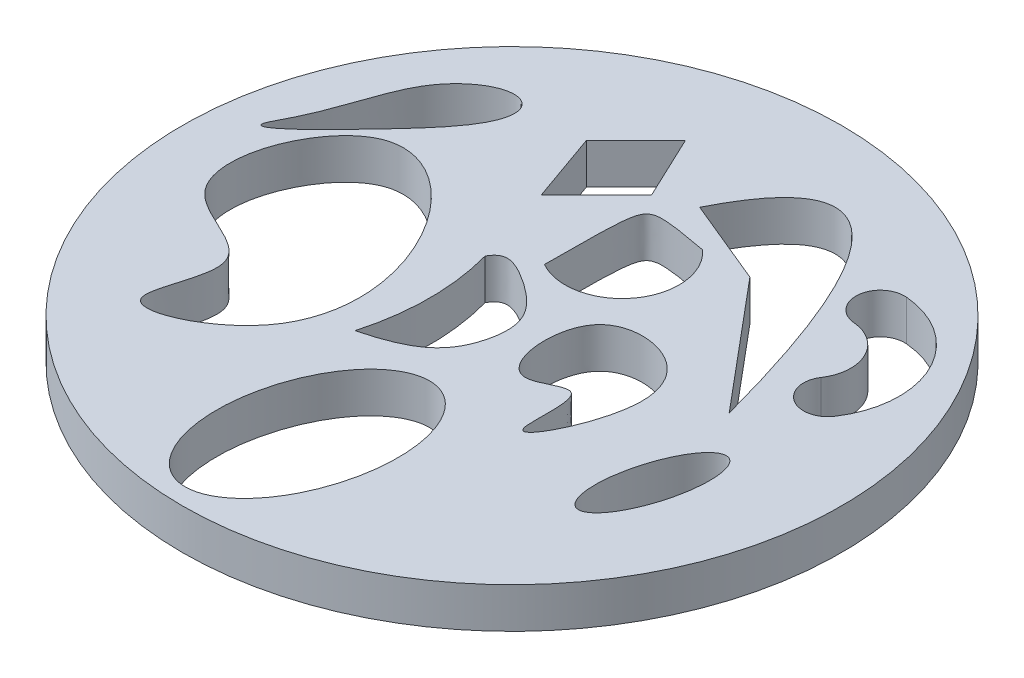
ISO-10303-21;
HEADER;
FILE_DESCRIPTION(('STEP AP214'),'2;1');
FILE_NAME('part.step','',(''),(''),'','','');
FILE_SCHEMA(('AUTOMOTIVE_DESIGN { 1 0 10303 214 1 1 1 1 }'));
ENDSEC;
DATA;
#1=APPLICATION_CONTEXT('core data for automotive mechanical design processes');
#2=APPLICATION_PROTOCOL_DEFINITION('international standard','automotive_design',2000,#1);
#3=PRODUCT_CONTEXT('',#1,'mechanical');
#4=PRODUCT('Part','Part','',(#3));
#5=PRODUCT_RELATED_PRODUCT_CATEGORY('part','',(#4));
#6=PRODUCT_DEFINITION_FORMATION('','',#4);
#7=PRODUCT_DEFINITION_CONTEXT('part definition',#1,'design');
#8=PRODUCT_DEFINITION('design','',#6,#7);
#9=PRODUCT_DEFINITION_SHAPE('','',#8);
#10=(LENGTH_UNIT() NAMED_UNIT(*) SI_UNIT(.MILLI.,.METRE.));
#11=(NAMED_UNIT(*) PLANE_ANGLE_UNIT() SI_UNIT($,.RADIAN.));
#12=(NAMED_UNIT(*) SI_UNIT($,.STERADIAN.) SOLID_ANGLE_UNIT());
#13=UNCERTAINTY_MEASURE_WITH_UNIT(LENGTH_MEASURE(1.E-05),#10,'distance_accuracy_value','');
#14=(GEOMETRIC_REPRESENTATION_CONTEXT(3) GLOBAL_UNCERTAINTY_ASSIGNED_CONTEXT((#13)) GLOBAL_UNIT_ASSIGNED_CONTEXT((#10,
#11,#12)) REPRESENTATION_CONTEXT('',''));
#15=CARTESIAN_POINT('',(0.,0.,0.));
#16=DIRECTION('',(0.,0.,1.));
#17=DIRECTION('',(1.,0.,0.));
#18=AXIS2_PLACEMENT_3D('',#15,#16,#17);
#19=CARTESIAN_POINT('',(0.,10.,0.));
#20=DIRECTION('',(0.,1.,0.));
#21=DIRECTION('',(0.,0.,1.));
#22=AXIS2_PLACEMENT_3D('',#19,#20,#21);
#23=PLANE('',#22);
#24=DIRECTION('',(0.642401427443981,0.,0.766368322686902));
#25=VECTOR('',#24,1.);
#26=CARTESIAN_POINT('',(47.7077937682597,10.,-5.98928534239551));
#27=LINE('',#26,#25);
#28=CARTESIAN_POINT('',(21.1652335710862,10.,-37.6538745993953));
#29=VERTEX_POINT('',#28);
#30=CARTESIAN_POINT('',(47.7077937682604,10.,-5.98928534239551));
#31=VERTEX_POINT('',#30);
#32=EDGE_CURVE('E201',#29,#31,#27,.T.);
#33=ORIENTED_EDGE('',*,*,#32,.F.);
#34=DIRECTION('',(0.92405875541636,0.,0.38225046309765));
#35=VECTOR('',#34,1.);
#36=CARTESIAN_POINT('',(21.1652335710862,10.,-37.6538745993953));
#37=LINE('',#36,#35);
#38=CARTESIAN_POINT('',(-1.30695454458873E-08,10.,-46.4091840021159));
#39=VERTEX_POINT('',#38);
#40=EDGE_CURVE('E194',#39,#29,#37,.T.);
#41=ORIENTED_EDGE('',*,*,#40,.F.);
#42=CARTESIAN_POINT('',(4110.14192783815,10.,999936.835006061));
#43=CARTESIAN_POINT('',(16.7558099104435,10.,-1000063.16499394));
#44=CARTESIAN_POINT('',(-4076.63030801726,10.,999936.835006061));
#45=B_SPLINE_CURVE_WITH_KNOTS('',2,(#42,#43,#44),.UNSPECIFIED.,.F.,.F.,(3,3),(0.,1.),.UNSPECIFIED.);
#46=EDGE_CURVE('E211',#31,#39,#45,.T.);
#47=ORIENTED_EDGE('',*,*,#46,.F.);
#48=EDGE_LOOP('',(#33,#41,#47));
#49=FACE_BOUND('',#48,.T.);
#50=CARTESIAN_POINT('',(-60.2461256371498,10.,-38.0722253658242));
#51=CARTESIAN_POINT('',(-68.8475962548978,10.,-23.7834864466906));
#52=CARTESIAN_POINT('',(-66.4014913895066,10.,-2.84437785859137));
#53=CARTESIAN_POINT('',(-76.8125951960883,10.,-17.3340389644636));
#54=CARTESIAN_POINT('',(-76.8125951960883,10.,-4.5885593225421));
#55=CARTESIAN_POINT('',(-72.4962680677095,10.,1.15153525530332));
#56=CARTESIAN_POINT('',(-66.9644620234067,10.,-13.2488511846418));
#57=CARTESIAN_POINT('',(-56.5475600024001,10.,-25.8149536521159));
#58=CARTESIAN_POINT('',(-50.1294162151567,10.,-35.5592282174939));
#59=CARTESIAN_POINT('',(-34.3655391627635,10.,-29.0283284743964));
#60=CARTESIAN_POINT('',(-31.9956089185147,10.,-59.9993335351259));
#61=CARTESIAN_POINT('',(-51.6446550194019,10.,-52.3609642849578));
#62=CARTESIAN_POINT('',(-60.2461256371498,10.,-38.0722253658242));
#63=B_SPLINE_CURVE_WITH_KNOTS('',12,(#50,#51,#52,#53,#54,#55,#56,#57,#58,#59,#60,#61,#62),
.UNSPECIFIED.,.T.,.F.,(13,13),(0.,1.),.UNSPECIFIED.);
#64=CARTESIAN_POINT('',(-60.2461256371498,10.,-38.0722253658242));
#65=VERTEX_POINT('',#64);
#66=EDGE_CURVE('E244',#65,#65,#63,.T.);
#67=ORIENTED_EDGE('',*,*,#66,.F.);
#68=EDGE_LOOP('',(#67));
#69=FACE_BOUND('',#68,.T.);
#70=CARTESIAN_POINT('',(53.1183360046607,10.,18.4093437831844));
#71=DIRECTION('',(0.,1.,0.));
#72=DIRECTION('',(-0.252123273324646,0.,0.967695125051308));
#73=AXIS2_PLACEMENT_3D('',#70,#71,#72);
#74=ELLIPSE('',#73,15.3556656612494,5.59116409325104);
#75=CARTESIAN_POINT('',(49.2468153140676,10.,33.2689465854933));
#76=VERTEX_POINT('',#75);
#77=EDGE_CURVE('E395',#76,#76,#74,.T.);
#78=ORIENTED_EDGE('',*,*,#77,.F.);
#79=EDGE_LOOP('',(#78));
#80=FACE_BOUND('',#79,.T.);
#81=DIRECTION('',(-0.707106781186541,0.,0.707106781186554));
#82=VECTOR('',#81,1.);
#83=CARTESIAN_POINT('',(-16.0943963613468,10.,-58.9760414610997));
#84=LINE('',#83,#82);
#85=CARTESIAN_POINT('',(-16.0943963613468,10.,-58.9760414610997));
#86=VERTEX_POINT('',#85);
#87=CARTESIAN_POINT('',(-28.3305470196309,10.,-46.7398908028154));
#88=VERTEX_POINT('',#87);
#89=EDGE_CURVE('E406',#86,#88,#84,.T.);
#90=ORIENTED_EDGE('',*,*,#89,.F.);
#91=DIRECTION('',(-0.427682246328038,0.,-0.903929143338018));
#92=VECTOR('',#91,1.);
#93=CARTESIAN_POINT('',(-8.57081724037484,10.,-43.0745573849061));
#94=LINE('',#93,#92);
#95=CARTESIAN_POINT('',(-8.57081724037484,10.,-43.0745573849061));
#96=VERTEX_POINT('',#95);
#97=EDGE_CURVE('E411',#96,#86,#94,.T.);
#98=ORIENTED_EDGE('',*,*,#97,.F.);
#99=DIRECTION('',(0.707106781186541,0.,-0.707106781186554));
#100=VECTOR('',#99,1.);
#101=CARTESIAN_POINT('',(-22.2124716904889,10.,-29.4329029347918));
#102=LINE('',#101,#100);
#103=CARTESIAN_POINT('',(-22.2124716904889,10.,-29.4329029347918));
#104=VERTEX_POINT('',#103);
#105=EDGE_CURVE('E417',#104,#96,#102,.T.);
#106=ORIENTED_EDGE('',*,*,#105,.F.);
#107=DIRECTION('',(0.333291257175319,0.,0.942823916694149));
#108=VECTOR('',#107,1.);
#109=CARTESIAN_POINT('',(-28.3305470196309,10.,-46.7398908028154));
#110=LINE('',#109,#108);
#111=EDGE_CURVE('E410',#88,#104,#110,.T.);
#112=ORIENTED_EDGE('',*,*,#111,.F.);
#113=EDGE_LOOP('',(#90,#98,#106,#112));
#114=FACE_BOUND('',#113,.T.);
#115=CARTESIAN_POINT('',(0.,10.,0.));
#116=DIRECTION('',(0.,1.,0.));
#117=DIRECTION('',(0.,0.,1.));
#118=AXIS2_PLACEMENT_3D('',#115,#116,#117);
#119=CIRCLE('',#118,81.477824485353);
#120=CARTESIAN_POINT('',(0.,10.,81.477824485353));
#121=VERTEX_POINT('',#120);
#122=EDGE_CURVE('E12',#121,#121,#119,.T.);
#123=ORIENTED_EDGE('',*,*,#122,.T.);
#124=EDGE_LOOP('',(#123));
#125=FACE_BOUND('',#124,.T.);
#126=CARTESIAN_POINT('',(-53.8457405612419,10.,-21.6533198344786));
#127=CARTESIAN_POINT('',(-64.2193672371354,10.,-17.4131257533633));
#128=CARTESIAN_POINT('',(-77.2513463662583,10.,15.4345354592304));
#129=CARTESIAN_POINT('',(-39.38956165981,10.,18.7157987433738));
#130=CARTESIAN_POINT('',(-57.7600365583191,10.,50.5739384334702));
#131=CARTESIAN_POINT('',(-1.86321618465855,10.,26.4172559044941));
#132=CARTESIAN_POINT('',(-36.0843087629834,10.,-28.9132608691913));
#133=CARTESIAN_POINT('',(-53.8457405612419,10.,-21.6533198344786));
#134=B_SPLINE_CURVE_WITH_KNOTS('',3,(#126,#127,#128,#129,#130,#131,#132,#133),.UNSPECIFIED.,.T.,
.F.,(4,1,1,1,1,4),(0.,0.221507195278026,0.35881524918199,0.472151534073453,0.620741610945306,
1.),.UNSPECIFIED.);
#135=CARTESIAN_POINT('',(-53.8457405612419,10.,-21.6533198344786));
#136=VERTEX_POINT('',#135);
#137=EDGE_CURVE('E322',#136,#136,#134,.T.);
#138=ORIENTED_EDGE('',*,*,#137,.F.);
#139=EDGE_LOOP('',(#138));
#140=FACE_BOUND('',#139,.T.);
#141=CARTESIAN_POINT('',(42.9554537836132,10.,-30.6089844020252));
#142=DIRECTION('',(0.,1.,0.));
#143=DIRECTION('',(0.,0.,1.));
#144=AXIS2_PLACEMENT_3D('',#141,#142,#143);
#145=CIRCLE('',#144,22.1933698362384);
#146=CARTESIAN_POINT('',(61.4432220004069,10.,-18.3310329829093));
#147=VERTEX_POINT('',#146);
#148=CARTESIAN_POINT('',(44.8189508500984,10.,-52.7239802955644));
#149=VERTEX_POINT('',#148);
#150=EDGE_CURVE('E350',#147,#149,#145,.T.);
#151=ORIENTED_EDGE('',*,*,#150,.F.);
#152=CARTESIAN_POINT('',(56.44062285623,10.,-21.6533198344786));
#153=DIRECTION('',(0.,1.,0.));
#154=DIRECTION('',(0.,0.,1.));
#155=AXIS2_PLACEMENT_3D('',#152,#153,#154);
#156=CIRCLE('',#155,6.00529667222442);
#157=CARTESIAN_POINT('',(51.4380237120531,10.,-24.975606686048));
#158=VERTEX_POINT('',#157);
#159=EDGE_CURVE('E355',#158,#147,#156,.T.);
#160=ORIENTED_EDGE('',*,*,#159,.F.);
#161=CARTESIAN_POINT('',(42.9554537836132,10.,-30.6089844020252));
#162=DIRECTION('',(0.,-1.,0.));
#163=DIRECTION('',(0.,0.,1.));
#164=AXIS2_PLACEMENT_3D('',#161,#162,#163);
#165=CIRCLE('',#164,10.1827764917895);
#166=CARTESIAN_POINT('',(43.8104647288253,10.,-40.7558013100663));
#167=VERTEX_POINT('',#166);
#168=EDGE_CURVE('E362',#167,#158,#165,.T.);
#169=ORIENTED_EDGE('',*,*,#168,.F.);
#170=CARTESIAN_POINT('',(44.3147077894618,10.,-46.7398908028154));
#171=DIRECTION('',(0.,1.,0.));
#172=DIRECTION('',(0.,0.,1.));
#173=AXIS2_PLACEMENT_3D('',#170,#171,#172);
#174=CIRCLE('',#173,6.00529667222442);
#175=EDGE_CURVE('E354',#149,#167,#174,.T.);
#176=ORIENTED_EDGE('',*,*,#175,.F.);
#177=EDGE_LOOP('',(#151,#160,#169,#176));
#178=FACE_BOUND('',#177,.T.);
#179=CARTESIAN_POINT('',(0.,10.,50.5981365058781));
#180=DIRECTION('',(0.,1.,0.));
#181=DIRECTION('',(0.213452035004488,0.,-0.976953544828229));
#182=AXIS2_PLACEMENT_3D('',#179,#180,#181);
#183=ELLIPSE('',#182,26.8549829413215,15.6384075360934);
#184=CARTESIAN_POINT('',(5.73225075883588,10.,24.3620657250524));
#185=VERTEX_POINT('',#184);
#186=EDGE_CURVE('E370',#185,#185,#183,.T.);
#187=ORIENTED_EDGE('',*,*,#186,.F.);
#188=EDGE_LOOP('',(#187));
#189=FACE_BOUND('',#188,.T.);
#190=CARTESIAN_POINT('',(0.,10.,-27.2281911044703));
#191=DIRECTION('',(0.,1.,0.));
#192=DIRECTION('',(0.,0.,-1.));
#193=AXIS2_PLACEMENT_3D('',#190,#191,#192);
#194=CIRCLE('',#193,14.0914946867553);
#195=CARTESIAN_POINT('',(-6.94728403857215,10.,-14.9682780952253));
#196=VERTEX_POINT('',#195);
#197=CARTESIAN_POINT('',(9.48026087038239,10.,-37.6538745993953));
#198=VERTEX_POINT('',#197);
#199=EDGE_CURVE('E485',#196,#198,#194,.T.);
#200=ORIENTED_EDGE('',*,*,#199,.F.);
#201=CARTESIAN_POINT('',(9.48026087038239,10.,-37.6538745993953));
#202=CARTESIAN_POINT('',(-6.94728403857216,10.,-40.7558013100663));
#203=CARTESIAN_POINT('',(-6.94728403857216,10.,-14.9682780952253));
#204=(BOUNDED_CURVE() B_SPLINE_CURVE(2,(#201,#202,#203),.UNSPECIFIED.,.F.,
.F.) B_SPLINE_CURVE_WITH_KNOTS((3,3),(0.,1.),
.UNSPECIFIED.) CURVE() GEOMETRIC_REPRESENTATION_ITEM() RATIONAL_B_SPLINE_CURVE((1.,
4.38264064922356,1.)) REPRESENTATION_ITEM(''));
#205=EDGE_CURVE('E266',#198,#196,#204,.T.);
#206=ORIENTED_EDGE('',*,*,#205,.F.);
#207=EDGE_LOOP('',(#200,#206));
#208=FACE_BOUND('',#207,.T.);
#209=CARTESIAN_POINT('',(15.2779976778549,10.,11.5747371091878));
#210=CARTESIAN_POINT('',(17.9895501551219,10.,11.3423388961398));
#211=CARTESIAN_POINT('',(27.4077540305126,10.,3.65496847968335));
#212=CARTESIAN_POINT('',(22.1887993003057,10.,35.4569639548572));
#213=CARTESIAN_POINT('',(39.4257297555551,10.,1.96505973056979));
#214=CARTESIAN_POINT('',(27.9498160705828,10.,-13.1048258605977));
#215=CARTESIAN_POINT('',(6.42234260404827,10.,-11.4186738447599));
#216=CARTESIAN_POINT('',(9.05419731412701,10.,12.1081584960222));
#217=CARTESIAN_POINT('',(15.2779976778549,10.,11.5747371091878));
#218=B_SPLINE_CURVE_WITH_KNOTS('',3,(#209,#210,#211,#212,#213,#214,#215,#216,#217),
.UNSPECIFIED.,.T.,.F.,(4,1,1,1,1,1,4),(0.,0.0908807333487496,0.237667111495493,0.46104858220229,
0.642529712534307,0.791402325415475,1.),.UNSPECIFIED.);
#219=CARTESIAN_POINT('',(15.2779976778549,10.,11.5747371091878));
#220=VERTEX_POINT('',#219);
#221=EDGE_CURVE('E189',#220,#220,#218,.T.);
#222=ORIENTED_EDGE('',*,*,#221,.F.);
#223=EDGE_LOOP('',(#222));
#224=FACE_BOUND('',#223,.T.);
#225=CARTESIAN_POINT('',(-73.2719421690832,10.,6.40055403903952));
#226=DIRECTION('',(0.,-1.,0.));
#227=DIRECTION('',(0.,0.,-1.));
#228=AXIS2_PLACEMENT_3D('',#225,#226,#227);
#229=CIRCLE('',#228,59.3304162015585);
#230=CARTESIAN_POINT('',(-16.0943963613468,10.,-9.43695024839044));
#231=VERTEX_POINT('',#230);
#232=CARTESIAN_POINT('',(-16.2029318401465,10.,22.6248058469309));
#233=VERTEX_POINT('',#232);
#234=EDGE_CURVE('E146',#231,#233,#229,.T.);
#235=ORIENTED_EDGE('',*,*,#234,.F.);
#236=CARTESIAN_POINT('',(-16.2029318401465,10.,22.6248058469309));
#237=CARTESIAN_POINT('',(7.54956019871239,10.,16.542418670708));
#238=CARTESIAN_POINT('',(-2.44250477017163,10.,10.1030879129828));
#239=CARTESIAN_POINT('',(5.55114720493557,10.,3.66375715525751));
#240=CARTESIAN_POINT('',(8.43774375150208,10.,-6.77239959002137));
#241=CARTESIAN_POINT('',(-5.10705542854073,10.,-1.66534416148064));
#242=CARTESIAN_POINT('',(-11.1022944098711,10.,-18.3187857762874));
#243=CARTESIAN_POINT('',(-16.0943963613468,10.,-9.43695024839044));
#244=B_SPLINE_CURVE_WITH_KNOTS('',7,(#236,#237,#238,#239,#240,#241,#242,#243),.UNSPECIFIED.,.F.,
.F.,(8,8),(0.,1.),.UNSPECIFIED.);
#245=EDGE_CURVE('E153',#233,#231,#244,.T.);
#246=ORIENTED_EDGE('',*,*,#245,.F.);
#247=EDGE_LOOP('',(#235,#246));
#248=FACE_BOUND('',#247,.T.);
#249=ADVANCED_FACE('F38',(#49,#69,#80,#114,#125,#140,#178,#189,#208,#224,#248),#23,.T.);
#250=CARTESIAN_POINT('',(0.,0.,0.));
#251=DIRECTION('',(0.,1.,0.));
#252=DIRECTION('',(0.,0.,1.));
#253=AXIS2_PLACEMENT_3D('',#250,#251,#252);
#254=PLANE('',#253);
#255=CARTESIAN_POINT('',(15.2779976778549,0.,11.5747371091878));
#256=CARTESIAN_POINT('',(17.9895501551219,0.,11.3423388961398));
#257=CARTESIAN_POINT('',(27.4077540305126,0.,3.65496847968335));
#258=CARTESIAN_POINT('',(22.1887993003057,0.,35.4569639548572));
#259=CARTESIAN_POINT('',(39.4257297555551,0.,1.96505973056979));
#260=CARTESIAN_POINT('',(27.9498160705828,0.,-13.1048258605977));
#261=CARTESIAN_POINT('',(6.42234260404827,0.,-11.4186738447599));
#262=CARTESIAN_POINT('',(9.05419731412701,0.,12.1081584960222));
#263=CARTESIAN_POINT('',(15.2779976778549,0.,11.5747371091878));
#264=B_SPLINE_CURVE_WITH_KNOTS('',3,(#255,#256,#257,#258,#259,#260,#261,#262,#263),
.UNSPECIFIED.,.T.,.F.,(4,1,1,1,1,1,4),(0.,0.0908807333487496,0.237667111495493,0.46104858220229,
0.642529712534307,0.791402325415475,1.),.UNSPECIFIED.);
#265=CARTESIAN_POINT('',(15.2779976778549,0.,11.5747371091878));
#266=VERTEX_POINT('',#265);
#267=EDGE_CURVE('E182',#266,#266,#264,.T.);
#268=ORIENTED_EDGE('',*,*,#267,.T.);
#269=EDGE_LOOP('',(#268));
#270=FACE_BOUND('',#269,.T.);
#271=DIRECTION('',(0.92405875541636,0.,0.38225046309765));
#272=VECTOR('',#271,1.);
#273=CARTESIAN_POINT('',(21.1652335710862,0.,-37.6538745993953));
#274=LINE('',#273,#272);
#275=CARTESIAN_POINT('',(-1.30691013566775E-08,0.,-46.4091840021168));
#276=VERTEX_POINT('',#275);
#277=CARTESIAN_POINT('',(21.1652335710862,0.,-37.6538745993953));
#278=VERTEX_POINT('',#277);
#279=EDGE_CURVE('E217',#276,#278,#274,.T.);
#280=ORIENTED_EDGE('',*,*,#279,.T.);
#281=DIRECTION('',(0.642401427443981,0.,0.766368322686902));
#282=VECTOR('',#281,1.);
#283=CARTESIAN_POINT('',(47.7077937682597,0.,-5.98928534239551));
#284=LINE('',#283,#282);
#285=CARTESIAN_POINT('',(47.7077937682597,0.,-5.98928534239551));
#286=VERTEX_POINT('',#285);
#287=EDGE_CURVE('E506',#278,#286,#284,.T.);
#288=ORIENTED_EDGE('',*,*,#287,.T.);
#289=CARTESIAN_POINT('',(4110.14192783815,0.,999936.835006061));
#290=CARTESIAN_POINT('',(16.7558099104435,0.,-1000063.16499394));
#291=CARTESIAN_POINT('',(-4076.63030801726,0.,999936.835006061));
#292=B_SPLINE_CURVE_WITH_KNOTS('',2,(#289,#290,#291),.UNSPECIFIED.,.F.,.F.,(3,3),(0.,1.),.UNSPECIFIED.);
#293=EDGE_CURVE('E202',#286,#276,#292,.T.);
#294=ORIENTED_EDGE('',*,*,#293,.T.);
#295=EDGE_LOOP('',(#280,#288,#294));
#296=FACE_BOUND('',#295,.T.);
#297=CARTESIAN_POINT('',(0.,0.,50.5981365058781));
#298=DIRECTION('',(0.,1.,0.));
#299=DIRECTION('',(0.213452035004488,0.,-0.976953544828229));
#300=AXIS2_PLACEMENT_3D('',#297,#298,#299);
#301=ELLIPSE('',#300,26.8549829413215,15.6384075360934);
#302=CARTESIAN_POINT('',(5.73225075883588,0.,24.3620657250524));
#303=VERTEX_POINT('',#302);
#304=EDGE_CURVE('E377',#303,#303,#301,.T.);
#305=ORIENTED_EDGE('',*,*,#304,.T.);
#306=EDGE_LOOP('',(#305));
#307=FACE_BOUND('',#306,.T.);
#308=CARTESIAN_POINT('',(53.1183360046607,0.,18.4093437831844));
#309=DIRECTION('',(0.,1.,0.));
#310=DIRECTION('',(-0.252123273324646,0.,0.967695125051308));
#311=AXIS2_PLACEMENT_3D('',#308,#309,#310);
#312=ELLIPSE('',#311,15.3556656612494,5.59116409325104);
#313=CARTESIAN_POINT('',(49.2468153140676,0.,33.2689465854933));
#314=VERTEX_POINT('',#313);
#315=EDGE_CURVE('E376',#314,#314,#312,.T.);
#316=ORIENTED_EDGE('',*,*,#315,.T.);
#317=EDGE_LOOP('',(#316));
#318=FACE_BOUND('',#317,.T.);
#319=CARTESIAN_POINT('',(56.44062285623,0.,-21.6533198344786));
#320=DIRECTION('',(0.,1.,0.));
#321=DIRECTION('',(0.,0.,1.));
#322=AXIS2_PLACEMENT_3D('',#319,#320,#321);
#323=CIRCLE('',#322,6.00529667222442);
#324=CARTESIAN_POINT('',(51.4380237120531,0.,-24.975606686048));
#325=VERTEX_POINT('',#324);
#326=CARTESIAN_POINT('',(61.4432220004069,0.,-18.3310329829093));
#327=VERTEX_POINT('',#326);
#328=EDGE_CURVE('E399',#325,#327,#323,.T.);
#329=ORIENTED_EDGE('',*,*,#328,.T.);
#330=CARTESIAN_POINT('',(42.9554537836132,0.,-30.6089844020252));
#331=DIRECTION('',(0.,1.,0.));
#332=DIRECTION('',(0.,0.,1.));
#333=AXIS2_PLACEMENT_3D('',#330,#331,#332);
#334=CIRCLE('',#333,22.1933698362384);
#335=CARTESIAN_POINT('',(44.8189508500984,0.,-52.7239802955644));
#336=VERTEX_POINT('',#335);
#337=EDGE_CURVE('E527',#327,#336,#334,.T.);
#338=ORIENTED_EDGE('',*,*,#337,.T.);
#339=CARTESIAN_POINT('',(44.3147077894618,0.,-46.7398908028154));
#340=DIRECTION('',(0.,1.,0.));
#341=DIRECTION('',(0.,0.,1.));
#342=AXIS2_PLACEMENT_3D('',#339,#340,#341);
#343=CIRCLE('',#342,6.00529667222442);
#344=CARTESIAN_POINT('',(43.8104647288253,0.,-40.7558013100663));
#345=VERTEX_POINT('',#344);
#346=EDGE_CURVE('E532',#336,#345,#343,.T.);
#347=ORIENTED_EDGE('',*,*,#346,.T.);
#348=CARTESIAN_POINT('',(42.9554537836132,0.,-30.6089844020252));
#349=DIRECTION('',(0.,-1.,0.));
#350=DIRECTION('',(0.,0.,1.));
#351=AXIS2_PLACEMENT_3D('',#348,#349,#350);
#352=CIRCLE('',#351,10.1827764917895);
#353=EDGE_CURVE('E537',#345,#325,#352,.T.);
#354=ORIENTED_EDGE('',*,*,#353,.T.);
#355=EDGE_LOOP('',(#329,#338,#347,#354));
#356=FACE_BOUND('',#355,.T.);
#357=CARTESIAN_POINT('',(0.,0.,0.));
#358=DIRECTION('',(0.,1.,0.));
#359=DIRECTION('',(0.,0.,1.));
#360=AXIS2_PLACEMENT_3D('',#357,#358,#359);
#361=CIRCLE('',#360,81.477824485353);
#362=CARTESIAN_POINT('',(0.,0.,81.477824485353));
#363=VERTEX_POINT('',#362);
#364=EDGE_CURVE('E42',#363,#363,#361,.T.);
#365=ORIENTED_EDGE('',*,*,#364,.F.);
#366=EDGE_LOOP('',(#365));
#367=FACE_BOUND('',#366,.T.);
#368=DIRECTION('',(-0.427682246328038,0.,-0.903929143338018));
#369=VECTOR('',#368,1.);
#370=CARTESIAN_POINT('',(-8.57081724037484,0.,-43.0745573849061));
#371=LINE('',#370,#369);
#372=CARTESIAN_POINT('',(-8.57081724037484,0.,-43.0745573849061));
#373=VERTEX_POINT('',#372);
#374=CARTESIAN_POINT('',(-16.0943963613468,0.,-58.9760414610997));
#375=VERTEX_POINT('',#374);
#376=EDGE_CURVE('E330',#373,#375,#371,.T.);
#377=ORIENTED_EDGE('',*,*,#376,.T.);
#378=DIRECTION('',(-0.707106781186541,0.,0.707106781186554));
#379=VECTOR('',#378,1.);
#380=CARTESIAN_POINT('',(-16.0943963613468,0.,-58.9760414610997));
#381=LINE('',#380,#379);
#382=CARTESIAN_POINT('',(-28.3305470196309,0.,-46.7398908028154));
#383=VERTEX_POINT('',#382);
#384=EDGE_CURVE('E426',#375,#383,#381,.T.);
#385=ORIENTED_EDGE('',*,*,#384,.T.);
#386=DIRECTION('',(0.333291257175319,0.,0.942823916694149));
#387=VECTOR('',#386,1.);
#388=CARTESIAN_POINT('',(-28.3305470196309,0.,-46.7398908028154));
#389=LINE('',#388,#387);
#390=CARTESIAN_POINT('',(-22.2124716904889,0.,-29.4329029347918));
#391=VERTEX_POINT('',#390);
#392=EDGE_CURVE('E437',#383,#391,#389,.T.);
#393=ORIENTED_EDGE('',*,*,#392,.T.);
#394=DIRECTION('',(0.707106781186541,0.,-0.707106781186554));
#395=VECTOR('',#394,1.);
#396=CARTESIAN_POINT('',(-22.2124716904889,0.,-29.4329029347918));
#397=LINE('',#396,#395);
#398=EDGE_CURVE('E441',#391,#373,#397,.T.);
#399=ORIENTED_EDGE('',*,*,#398,.T.);
#400=EDGE_LOOP('',(#377,#385,#393,#399));
#401=FACE_BOUND('',#400,.T.);
#402=CARTESIAN_POINT('',(-53.8457405612419,0.,-21.6533198344786));
#403=CARTESIAN_POINT('',(-64.2193672371354,0.,-17.4131257533633));
#404=CARTESIAN_POINT('',(-77.2513463662583,0.,15.4345354592304));
#405=CARTESIAN_POINT('',(-39.38956165981,0.,18.7157987433738));
#406=CARTESIAN_POINT('',(-57.7600365583191,0.,50.5739384334702));
#407=CARTESIAN_POINT('',(-1.86321618465855,0.,26.4172559044941));
#408=CARTESIAN_POINT('',(-36.0843087629834,0.,-28.9132608691913));
#409=CARTESIAN_POINT('',(-53.8457405612419,0.,-21.6533198344786));
#410=B_SPLINE_CURVE_WITH_KNOTS('',3,(#402,#403,#404,#405,#406,#407,#408,#409),.UNSPECIFIED.,.T.,
.F.,(4,1,1,1,1,4),(0.,0.221507195278026,0.35881524918199,0.472151534073453,0.620741610945306,
1.),.UNSPECIFIED.);
#411=CARTESIAN_POINT('',(-53.8457405612419,0.,-21.6533198344786));
#412=VERTEX_POINT('',#411);
#413=EDGE_CURVE('E331',#412,#412,#410,.T.);
#414=ORIENTED_EDGE('',*,*,#413,.T.);
#415=EDGE_LOOP('',(#414));
#416=FACE_BOUND('',#415,.T.);
#417=CARTESIAN_POINT('',(9.48026087038239,0.,-37.6538745993953));
#418=CARTESIAN_POINT('',(-6.94728403857216,0.,-40.7558013100663));
#419=CARTESIAN_POINT('',(-6.94728403857216,0.,-14.9682780952253));
#420=(BOUNDED_CURVE() B_SPLINE_CURVE(2,(#417,#418,#419),.UNSPECIFIED.,.F.,
.F.) B_SPLINE_CURVE_WITH_KNOTS((3,3),(0.,1.),
.UNSPECIFIED.) CURVE() GEOMETRIC_REPRESENTATION_ITEM() RATIONAL_B_SPLINE_CURVE((1.,
4.38264064922356,1.)) REPRESENTATION_ITEM(''));
#421=CARTESIAN_POINT('',(9.48026087038239,0.,-37.6538745993953));
#422=VERTEX_POINT('',#421);
#423=CARTESIAN_POINT('',(-6.94728403857215,0.,-14.9682780952253));
#424=VERTEX_POINT('',#423);
#425=EDGE_CURVE('E252',#422,#424,#420,.T.);
#426=ORIENTED_EDGE('',*,*,#425,.T.);
#427=CARTESIAN_POINT('',(0.,0.,-27.2281911044703));
#428=DIRECTION('',(0.,1.,0.));
#429=DIRECTION('',(0.,0.,-1.));
#430=AXIS2_PLACEMENT_3D('',#427,#428,#429);
#431=CIRCLE('',#430,14.0914946867553);
#432=EDGE_CURVE('E473',#424,#422,#431,.T.);
#433=ORIENTED_EDGE('',*,*,#432,.T.);
#434=EDGE_LOOP('',(#426,#433));
#435=FACE_BOUND('',#434,.T.);
#436=CARTESIAN_POINT('',(-60.2461256371498,0.,-38.0722253658242));
#437=CARTESIAN_POINT('',(-68.8475962548978,0.,-23.7834864466906));
#438=CARTESIAN_POINT('',(-66.4014913895066,0.,-2.84437785859137));
#439=CARTESIAN_POINT('',(-76.8125951960883,0.,-17.3340389644636));
#440=CARTESIAN_POINT('',(-76.8125951960883,0.,-4.5885593225421));
#441=CARTESIAN_POINT('',(-72.4962680677095,0.,1.15153525530332));
#442=CARTESIAN_POINT('',(-66.9644620234067,0.,-13.2488511846418));
#443=CARTESIAN_POINT('',(-56.5475600024001,0.,-25.8149536521159));
#444=CARTESIAN_POINT('',(-50.1294162151567,0.,-35.5592282174939));
#445=CARTESIAN_POINT('',(-34.3655391627635,0.,-29.0283284743964));
#446=CARTESIAN_POINT('',(-31.9956089185147,0.,-59.9993335351259));
#447=CARTESIAN_POINT('',(-51.6446550194019,0.,-52.3609642849578));
#448=CARTESIAN_POINT('',(-60.2461256371498,0.,-38.0722253658242));
#449=B_SPLINE_CURVE_WITH_KNOTS('',12,(#436,#437,#438,#439,#440,#441,#442,#443,#444,#445,#446,
#447,#448),.UNSPECIFIED.,.T.,.F.,(13,13),(0.,1.),.UNSPECIFIED.);
#450=CARTESIAN_POINT('',(-60.2461256371498,0.,-38.0722253658242));
#451=VERTEX_POINT('',#450);
#452=EDGE_CURVE('E253',#451,#451,#449,.T.);
#453=ORIENTED_EDGE('',*,*,#452,.T.);
#454=EDGE_LOOP('',(#453));
#455=FACE_BOUND('',#454,.T.);
#456=CARTESIAN_POINT('',(-16.2029318401465,0.,22.6248058469309));
#457=CARTESIAN_POINT('',(7.54956019871239,0.,16.542418670708));
#458=CARTESIAN_POINT('',(-2.44250477017163,0.,10.1030879129828));
#459=CARTESIAN_POINT('',(5.55114720493557,0.,3.66375715525751));
#460=CARTESIAN_POINT('',(8.43774375150208,0.,-6.77239959002137));
#461=CARTESIAN_POINT('',(-5.10705542854073,0.,-1.66534416148064));
#462=CARTESIAN_POINT('',(-11.1022944098711,0.,-18.3187857762874));
#463=CARTESIAN_POINT('',(-16.0943963613468,0.,-9.43695024839044));
#464=B_SPLINE_CURVE_WITH_KNOTS('',7,(#456,#457,#458,#459,#460,#461,#462,#463),.UNSPECIFIED.,.F.,
.F.,(8,8),(0.,1.),.UNSPECIFIED.);
#465=CARTESIAN_POINT('',(-16.2029318401465,0.,22.6248058469309));
#466=VERTEX_POINT('',#465);
#467=CARTESIAN_POINT('',(-16.0943963613468,0.,-9.43695024839044));
#468=VERTEX_POINT('',#467);
#469=EDGE_CURVE('E62',#466,#468,#464,.T.);
#470=ORIENTED_EDGE('',*,*,#469,.T.);
#471=CARTESIAN_POINT('',(-73.2719421690832,0.,6.40055403903952));
#472=DIRECTION('',(0.,-1.,0.));
#473=DIRECTION('',(0.,0.,-1.));
#474=AXIS2_PLACEMENT_3D('',#471,#472,#473);
#475=CIRCLE('',#474,59.3304162015585);
#476=EDGE_CURVE('E158',#468,#466,#475,.T.);
#477=ORIENTED_EDGE('',*,*,#476,.T.);
#478=EDGE_LOOP('',(#470,#477));
#479=FACE_BOUND('',#478,.T.);
#480=ADVANCED_FACE('F287',(#270,#296,#307,#318,#356,#367,#401,#416,#435,#455,#479),#254,.F.);
#481=CARTESIAN_POINT('',(0.,10.,0.));
#482=DIRECTION('',(0.,-1.,0.));
#483=DIRECTION('',(0.,0.,-1.));
#484=AXIS2_PLACEMENT_3D('',#481,#482,#483);
#485=CYLINDRICAL_SURFACE('',#484,81.477824485353);
#486=ORIENTED_EDGE('',*,*,#122,.F.);
#487=EDGE_LOOP('',(#486));
#488=FACE_BOUND('',#487,.T.);
#489=ORIENTED_EDGE('',*,*,#364,.T.);
#490=EDGE_LOOP('',(#489));
#491=FACE_BOUND('',#490,.T.);
#492=ADVANCED_FACE('F40',(#488,#491),#485,.T.);
#493=CARTESIAN_POINT('',(-8.57081724037484,10.,-43.0745573849061));
#494=DIRECTION('',(-0.903929143338018,0.,0.427682246328038));
#495=DIRECTION('',(0.427682246328038,0.,0.903929143338018));
#496=AXIS2_PLACEMENT_3D('',#493,#494,#495);
#497=PLANE('',#496);
#498=ORIENTED_EDGE('',*,*,#376,.F.);
#499=DIRECTION('',(0.,-1.,0.));
#500=VECTOR('',#499,1.);
#501=CARTESIAN_POINT('',(-8.57081724037484,10.,-43.0745573849061));
#502=LINE('',#501,#500);
#503=EDGE_CURVE('E421',#96,#373,#502,.T.);
#504=ORIENTED_EDGE('',*,*,#503,.F.);
#505=ORIENTED_EDGE('',*,*,#97,.T.);
#506=DIRECTION('',(0.,-1.,0.));
#507=VECTOR('',#506,1.);
#508=CARTESIAN_POINT('',(-16.0943963613468,10.,-58.9760414610997));
#509=LINE('',#508,#507);
#510=EDGE_CURVE('E452',#86,#375,#509,.T.);
#511=ORIENTED_EDGE('',*,*,#510,.T.);
#512=EDGE_LOOP('',(#498,#504,#505,#511));
#513=FACE_BOUND('',#512,.T.);
#514=ADVANCED_FACE('F294',(#513),#497,.T.);
#515=CARTESIAN_POINT('',(-16.0943963613468,10.,-58.9760414610997));
#516=DIRECTION('',(0.707106781186554,0.,0.707106781186541));
#517=DIRECTION('',(0.707106781186541,0.,-0.707106781186554));
#518=AXIS2_PLACEMENT_3D('',#515,#516,#517);
#519=PLANE('',#518);
#520=ORIENTED_EDGE('',*,*,#384,.F.);
#521=ORIENTED_EDGE('',*,*,#510,.F.);
#522=ORIENTED_EDGE('',*,*,#89,.T.);
#523=DIRECTION('',(0.,-1.,0.));
#524=VECTOR('',#523,1.);
#525=CARTESIAN_POINT('',(-28.3305470196309,10.,-46.7398908028154));
#526=LINE('',#525,#524);
#527=EDGE_CURVE('E450',#88,#383,#526,.T.);
#528=ORIENTED_EDGE('',*,*,#527,.T.);
#529=EDGE_LOOP('',(#520,#521,#522,#528));
#530=FACE_BOUND('',#529,.T.);
#531=ADVANCED_FACE('F302',(#530),#519,.T.);
#532=CARTESIAN_POINT('',(-28.3305470196309,10.,-46.7398908028154));
#533=DIRECTION('',(0.942823916694149,0.,-0.333291257175319));
#534=DIRECTION('',(-0.333291257175319,0.,-0.942823916694149));
#535=AXIS2_PLACEMENT_3D('',#532,#533,#534);
#536=PLANE('',#535);
#537=ORIENTED_EDGE('',*,*,#392,.F.);
#538=ORIENTED_EDGE('',*,*,#527,.F.);
#539=ORIENTED_EDGE('',*,*,#111,.T.);
#540=DIRECTION('',(0.,-1.,0.));
#541=VECTOR('',#540,1.);
#542=CARTESIAN_POINT('',(-22.2124716904889,10.,-29.4329029347918));
#543=LINE('',#542,#541);
#544=EDGE_CURVE('E448',#104,#391,#543,.T.);
#545=ORIENTED_EDGE('',*,*,#544,.T.);
#546=EDGE_LOOP('',(#537,#538,#539,#545));
#547=FACE_BOUND('',#546,.T.);
#548=ADVANCED_FACE('F306',(#547),#536,.T.);
#549=CARTESIAN_POINT('',(-22.2124716904889,10.,-29.4329029347918));
#550=DIRECTION('',(-0.707106781186554,0.,-0.707106781186541));
#551=DIRECTION('',(-0.707106781186541,0.,0.707106781186554));
#552=AXIS2_PLACEMENT_3D('',#549,#550,#551);
#553=PLANE('',#552);
#554=ORIENTED_EDGE('',*,*,#398,.F.);
#555=ORIENTED_EDGE('',*,*,#544,.F.);
#556=ORIENTED_EDGE('',*,*,#105,.T.);
#557=ORIENTED_EDGE('',*,*,#503,.T.);
#558=EDGE_LOOP('',(#554,#555,#556,#557));
#559=FACE_BOUND('',#558,.T.);
#560=ADVANCED_FACE('F310',(#559),#553,.T.);
#561=DIRECTION('',(0.,-1.,0.));
#562=VECTOR('',#561,1.);
#563=SURFACE_OF_LINEAR_EXTRUSION('',#134,#562);
#564=ORIENTED_EDGE('',*,*,#137,.T.);
#565=EDGE_LOOP('',(#564));
#566=FACE_BOUND('',#565,.T.);
#567=ORIENTED_EDGE('',*,*,#413,.F.);
#568=EDGE_LOOP('',(#567));
#569=FACE_BOUND('',#568,.T.);
#570=ADVANCED_FACE('F314',(#566,#569),#563,.T.);
#571=CARTESIAN_POINT('',(56.44062285623,10.,-21.6533198344786));
#572=DIRECTION('',(0.,-1.,0.));
#573=DIRECTION('',(0.,0.,-1.));
#574=AXIS2_PLACEMENT_3D('',#571,#572,#573);
#575=CYLINDRICAL_SURFACE('',#574,6.00529667222442);
#576=ORIENTED_EDGE('',*,*,#328,.F.);
#577=DIRECTION('',(0.,-1.,0.));
#578=VECTOR('',#577,1.);
#579=CARTESIAN_POINT('',(51.4380237120531,10.,-24.975606686048));
#580=LINE('',#579,#578);
#581=EDGE_CURVE('E541',#158,#325,#580,.T.);
#582=ORIENTED_EDGE('',*,*,#581,.F.);
#583=ORIENTED_EDGE('',*,*,#159,.T.);
#584=DIRECTION('',(0.,-1.,0.));
#585=VECTOR('',#584,1.);
#586=CARTESIAN_POINT('',(61.4432220004069,10.,-18.3310329829093));
#587=LINE('',#586,#585);
#588=EDGE_CURVE('E332',#147,#327,#587,.T.);
#589=ORIENTED_EDGE('',*,*,#588,.T.);
#590=EDGE_LOOP('',(#576,#582,#583,#589));
#591=FACE_BOUND('',#590,.T.);
#592=ADVANCED_FACE('F319',(#591),#575,.F.);
#593=CARTESIAN_POINT('',(42.9554537836132,10.,-30.6089844020252));
#594=DIRECTION('',(0.,-1.,0.));
#595=DIRECTION('',(0.,0.,-1.));
#596=AXIS2_PLACEMENT_3D('',#593,#594,#595);
#597=CYLINDRICAL_SURFACE('',#596,22.1933698362384);
#598=ORIENTED_EDGE('',*,*,#337,.F.);
#599=ORIENTED_EDGE('',*,*,#588,.F.);
#600=ORIENTED_EDGE('',*,*,#150,.T.);
#601=DIRECTION('',(0.,-1.,0.));
#602=VECTOR('',#601,1.);
#603=CARTESIAN_POINT('',(44.8189508500984,10.,-52.7239802955644));
#604=LINE('',#603,#602);
#605=EDGE_CURVE('E545',#149,#336,#604,.T.);
#606=ORIENTED_EDGE('',*,*,#605,.T.);
#607=EDGE_LOOP('',(#598,#599,#600,#606));
#608=FACE_BOUND('',#607,.T.);
#609=ADVANCED_FACE('F575',(#608),#597,.F.);
#610=CARTESIAN_POINT('',(44.3147077894618,10.,-46.7398908028154));
#611=DIRECTION('',(0.,-1.,0.));
#612=DIRECTION('',(0.,0.,-1.));
#613=AXIS2_PLACEMENT_3D('',#610,#611,#612);
#614=CYLINDRICAL_SURFACE('',#613,6.00529667222442);
#615=ORIENTED_EDGE('',*,*,#346,.F.);
#616=ORIENTED_EDGE('',*,*,#605,.F.);
#617=ORIENTED_EDGE('',*,*,#175,.T.);
#618=DIRECTION('',(0.,-1.,0.));
#619=VECTOR('',#618,1.);
#620=CARTESIAN_POINT('',(43.8104647288253,10.,-40.7558013100663));
#621=LINE('',#620,#619);
#622=EDGE_CURVE('E544',#167,#345,#621,.T.);
#623=ORIENTED_EDGE('',*,*,#622,.T.);
#624=EDGE_LOOP('',(#615,#616,#617,#623));
#625=FACE_BOUND('',#624,.T.);
#626=ADVANCED_FACE('F577',(#625),#614,.F.);
#627=CARTESIAN_POINT('',(42.9554537836132,10.,-30.6089844020252));
#628=DIRECTION('',(0.,-1.,0.));
#629=DIRECTION('',(0.,0.,-1.));
#630=AXIS2_PLACEMENT_3D('',#627,#628,#629);
#631=CYLINDRICAL_SURFACE('',#630,10.1827764917895);
#632=ORIENTED_EDGE('',*,*,#353,.F.);
#633=ORIENTED_EDGE('',*,*,#622,.F.);
#634=ORIENTED_EDGE('',*,*,#168,.T.);
#635=ORIENTED_EDGE('',*,*,#581,.T.);
#636=EDGE_LOOP('',(#632,#633,#634,#635));
#637=FACE_BOUND('',#636,.T.);
#638=ADVANCED_FACE('F392',(#637),#631,.T.);
#639=DIRECTION('',(0.,-1.,0.));
#640=VECTOR('',#639,1.);
#641=SURFACE_OF_LINEAR_EXTRUSION('',#74,#640);
#642=ORIENTED_EDGE('',*,*,#77,.T.);
#643=EDGE_LOOP('',(#642));
#644=FACE_BOUND('',#643,.T.);
#645=ORIENTED_EDGE('',*,*,#315,.F.);
#646=EDGE_LOOP('',(#645));
#647=FACE_BOUND('',#646,.T.);
#648=ADVANCED_FACE('F388',(#644,#647),#641,.T.);
#649=DIRECTION('',(0.,-1.,0.));
#650=VECTOR('',#649,1.);
#651=SURFACE_OF_LINEAR_EXTRUSION('',#183,#650);
#652=ORIENTED_EDGE('',*,*,#186,.T.);
#653=EDGE_LOOP('',(#652));
#654=FACE_BOUND('',#653,.T.);
#655=ORIENTED_EDGE('',*,*,#304,.F.);
#656=EDGE_LOOP('',(#655));
#657=FACE_BOUND('',#656,.T.);
#658=ADVANCED_FACE('F384',(#654,#657),#651,.T.);
#659=DIRECTION('',(0.,-1.,0.));
#660=VECTOR('',#659,1.);
#661=SURFACE_OF_LINEAR_EXTRUSION('',#204,#660);
#662=ORIENTED_EDGE('',*,*,#425,.F.);
#663=DIRECTION('',(0.,-1.,0.));
#664=VECTOR('',#663,1.);
#665=CARTESIAN_POINT('',(9.48026087038239,10.,-37.6538745993953));
#666=LINE('',#665,#664);
#667=EDGE_CURVE('E491',#198,#422,#666,.T.);
#668=ORIENTED_EDGE('',*,*,#667,.F.);
#669=ORIENTED_EDGE('',*,*,#205,.T.);
#670=DIRECTION('',(0.,-1.,0.));
#671=VECTOR('',#670,1.);
#672=CARTESIAN_POINT('',(-6.94728403857215,10.,-14.9682780952253));
#673=LINE('',#672,#671);
#674=EDGE_CURVE('E378',#196,#424,#673,.T.);
#675=ORIENTED_EDGE('',*,*,#674,.T.);
#676=EDGE_LOOP('',(#662,#668,#669,#675));
#677=FACE_BOUND('',#676,.T.);
#678=ADVANCED_FACE('F387',(#677),#661,.T.);
#679=CARTESIAN_POINT('',(0.,10.,-27.2281911044703));
#680=DIRECTION('',(0.,-1.,0.));
#681=DIRECTION('',(0.,0.,-1.));
#682=AXIS2_PLACEMENT_3D('',#679,#680,#681);
#683=CYLINDRICAL_SURFACE('',#682,14.0914946867553);
#684=ORIENTED_EDGE('',*,*,#432,.F.);
#685=ORIENTED_EDGE('',*,*,#674,.F.);
#686=ORIENTED_EDGE('',*,*,#199,.T.);
#687=ORIENTED_EDGE('',*,*,#667,.T.);
#688=EDGE_LOOP('',(#684,#685,#686,#687));
#689=FACE_BOUND('',#688,.T.);
#690=ADVANCED_FACE('F241',(#689),#683,.F.);
#691=DIRECTION('',(0.,-1.,0.));
#692=VECTOR('',#691,1.);
#693=SURFACE_OF_LINEAR_EXTRUSION('',#63,#692);
#694=ORIENTED_EDGE('',*,*,#66,.T.);
#695=EDGE_LOOP('',(#694));
#696=FACE_BOUND('',#695,.T.);
#697=ORIENTED_EDGE('',*,*,#452,.F.);
#698=EDGE_LOOP('',(#697));
#699=FACE_BOUND('',#698,.T.);
#700=ADVANCED_FACE('F237',(#696,#699),#693,.T.);
#701=CARTESIAN_POINT('',(21.1652335710862,10.,-37.6538745993953));
#702=DIRECTION('',(0.38225046309765,0.,-0.92405875541636));
#703=DIRECTION('',(-0.92405875541636,0.,-0.38225046309765));
#704=AXIS2_PLACEMENT_3D('',#701,#702,#703);
#705=PLANE('',#704);
#706=ORIENTED_EDGE('',*,*,#279,.F.);
#707=DIRECTION('',(0.,-1.,0.));
#708=VECTOR('',#707,1.);
#709=CARTESIAN_POINT('',(-1.30695454458873E-08,10.,-46.4091840021159));
#710=LINE('',#709,#708);
#711=EDGE_CURVE('E216',#39,#276,#710,.T.);
#712=ORIENTED_EDGE('',*,*,#711,.F.);
#713=ORIENTED_EDGE('',*,*,#40,.T.);
#714=DIRECTION('',(0.,-1.,0.));
#715=VECTOR('',#714,1.);
#716=CARTESIAN_POINT('',(21.1652335710862,10.,-37.6538745993953));
#717=LINE('',#716,#715);
#718=EDGE_CURVE('E254',#29,#278,#717,.T.);
#719=ORIENTED_EDGE('',*,*,#718,.T.);
#720=EDGE_LOOP('',(#706,#712,#713,#719));
#721=FACE_BOUND('',#720,.T.);
#722=ADVANCED_FACE('F233',(#721),#705,.T.);
#723=CARTESIAN_POINT('',(47.7077937682597,10.,-5.98928534239551));
#724=DIRECTION('',(0.766368322686902,0.,-0.642401427443981));
#725=DIRECTION('',(-0.642401427443981,0.,-0.766368322686902));
#726=AXIS2_PLACEMENT_3D('',#723,#724,#725);
#727=PLANE('',#726);
#728=ORIENTED_EDGE('',*,*,#287,.F.);
#729=ORIENTED_EDGE('',*,*,#718,.F.);
#730=ORIENTED_EDGE('',*,*,#32,.T.);
#731=DIRECTION('',(0.,-1.,0.));
#732=VECTOR('',#731,1.);
#733=CARTESIAN_POINT('',(47.7077937682597,10.,-5.98928534239551));
#734=LINE('',#733,#732);
#735=EDGE_CURVE('E742',#31,#286,#734,.T.);
#736=ORIENTED_EDGE('',*,*,#735,.T.);
#737=EDGE_LOOP('',(#728,#729,#730,#736));
#738=FACE_BOUND('',#737,.T.);
#739=ADVANCED_FACE('F229',(#738),#727,.T.);
#740=DIRECTION('',(0.,-1.,0.));
#741=VECTOR('',#740,1.);
#742=SURFACE_OF_LINEAR_EXTRUSION('',#45,#741);
#743=ORIENTED_EDGE('',*,*,#293,.F.);
#744=ORIENTED_EDGE('',*,*,#735,.F.);
#745=ORIENTED_EDGE('',*,*,#46,.T.);
#746=ORIENTED_EDGE('',*,*,#711,.T.);
#747=EDGE_LOOP('',(#743,#744,#745,#746));
#748=FACE_BOUND('',#747,.T.);
#749=ADVANCED_FACE('F225',(#748),#742,.T.);
#750=DIRECTION('',(0.,-1.,0.));
#751=VECTOR('',#750,1.);
#752=SURFACE_OF_LINEAR_EXTRUSION('',#218,#751);
#753=ORIENTED_EDGE('',*,*,#221,.T.);
#754=EDGE_LOOP('',(#753));
#755=FACE_BOUND('',#754,.T.);
#756=ORIENTED_EDGE('',*,*,#267,.F.);
#757=EDGE_LOOP('',(#756));
#758=FACE_BOUND('',#757,.T.);
#759=ADVANCED_FACE('F228',(#755,#758),#752,.T.);
#760=DIRECTION('',(0.,-1.,0.));
#761=VECTOR('',#760,1.);
#762=SURFACE_OF_LINEAR_EXTRUSION('',#244,#761);
#763=ORIENTED_EDGE('',*,*,#469,.F.);
#764=DIRECTION('',(0.,-1.,0.));
#765=VECTOR('',#764,1.);
#766=CARTESIAN_POINT('',(-16.2029318401465,10.,22.6248058469309));
#767=LINE('',#766,#765);
#768=EDGE_CURVE('E148',#233,#466,#767,.T.);
#769=ORIENTED_EDGE('',*,*,#768,.F.);
#770=ORIENTED_EDGE('',*,*,#245,.T.);
#771=DIRECTION('',(0.,-1.,0.));
#772=VECTOR('',#771,1.);
#773=CARTESIAN_POINT('',(-16.0943963613468,10.,-9.43695024839044));
#774=LINE('',#773,#772);
#775=EDGE_CURVE('E55',#231,#468,#774,.T.);
#776=ORIENTED_EDGE('',*,*,#775,.T.);
#777=EDGE_LOOP('',(#763,#769,#770,#776));
#778=FACE_BOUND('',#777,.T.);
#779=ADVANCED_FACE('F155',(#778),#762,.T.);
#780=CARTESIAN_POINT('',(-73.2719421690832,10.,6.40055403903952));
#781=DIRECTION('',(0.,-1.,0.));
#782=DIRECTION('',(0.,0.,-1.));
#783=AXIS2_PLACEMENT_3D('',#780,#781,#782);
#784=CYLINDRICAL_SURFACE('',#783,59.3304162015585);
#785=ORIENTED_EDGE('',*,*,#476,.F.);
#786=ORIENTED_EDGE('',*,*,#775,.F.);
#787=ORIENTED_EDGE('',*,*,#234,.T.);
#788=ORIENTED_EDGE('',*,*,#768,.T.);
#789=EDGE_LOOP('',(#785,#786,#787,#788));
#790=FACE_BOUND('',#789,.T.);
#791=ADVANCED_FACE('F147',(#790),#784,.T.);
#792=CLOSED_SHELL('',(#249,#480,#492,#514,#531,#548,#560,#570,#592,#609,#626,#638,#648,#658,
#678,#690,#700,#722,#739,#749,#759,#779,#791));
#793=MANIFOLD_SOLID_BREP('B2',#792);
#794=ADVANCED_BREP_SHAPE_REPRESENTATION('',(#18,#793),#14);
#795=SHAPE_DEFINITION_REPRESENTATION(#9,#794);
ENDSEC;
END-ISO-10303-21;
